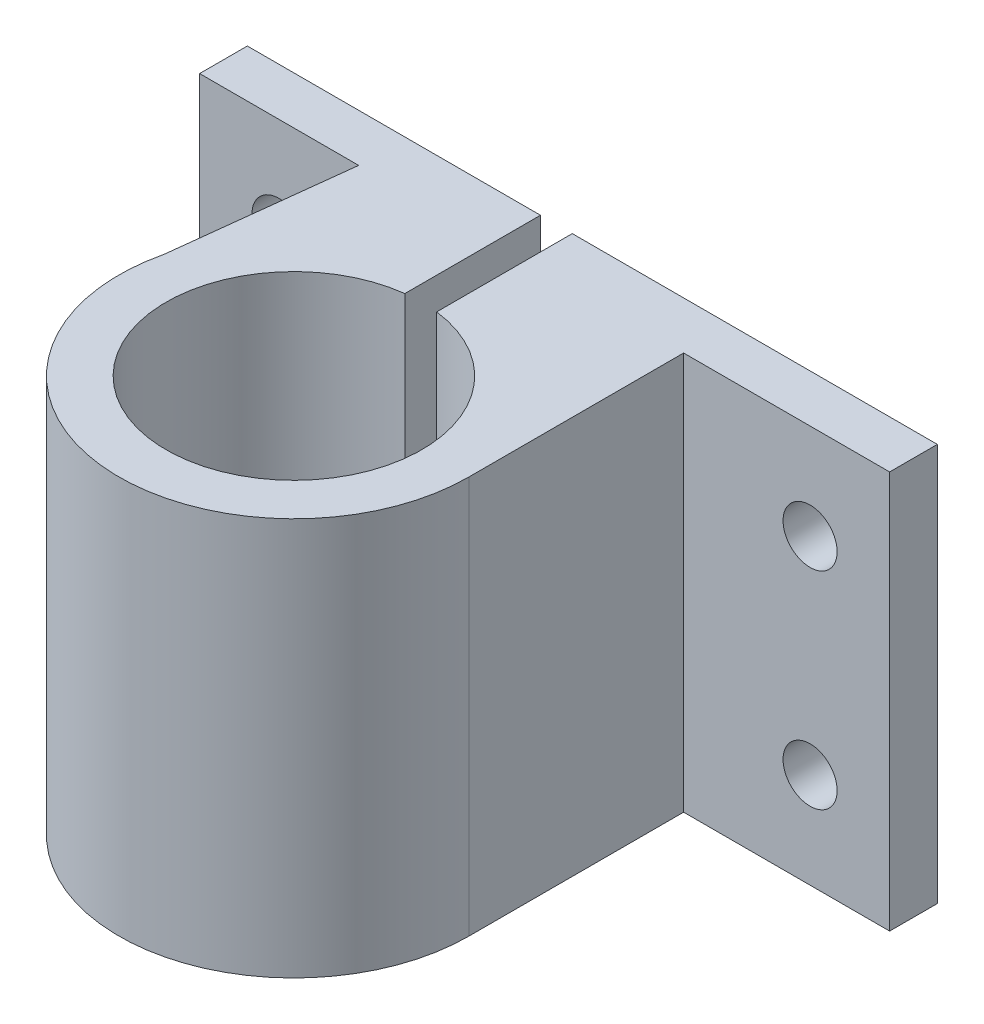
ISO-10303-21;
HEADER;
FILE_DESCRIPTION(('STEP AP214'),'2;1');
FILE_NAME('part.step','',(''),(''),'','','');
FILE_SCHEMA(('AUTOMOTIVE_DESIGN { 1 0 10303 214 1 1 1 1 }'));
ENDSEC;
DATA;
#1=APPLICATION_CONTEXT('core data for automotive mechanical design processes');
#2=APPLICATION_PROTOCOL_DEFINITION('international standard','automotive_design',2000,#1);
#3=PRODUCT_CONTEXT('',#1,'mechanical');
#4=PRODUCT('Part','Part','',(#3));
#5=PRODUCT_RELATED_PRODUCT_CATEGORY('part','',(#4));
#6=PRODUCT_DEFINITION_FORMATION('','',#4);
#7=PRODUCT_DEFINITION_CONTEXT('part definition',#1,'design');
#8=PRODUCT_DEFINITION('design','',#6,#7);
#9=PRODUCT_DEFINITION_SHAPE('','',#8);
#10=(LENGTH_UNIT() NAMED_UNIT(*) SI_UNIT(.MILLI.,.METRE.));
#11=(NAMED_UNIT(*) PLANE_ANGLE_UNIT() SI_UNIT($,.RADIAN.));
#12=(NAMED_UNIT(*) SI_UNIT($,.STERADIAN.) SOLID_ANGLE_UNIT());
#13=UNCERTAINTY_MEASURE_WITH_UNIT(LENGTH_MEASURE(1.E-05),#10,'distance_accuracy_value','');
#14=(GEOMETRIC_REPRESENTATION_CONTEXT(3) GLOBAL_UNCERTAINTY_ASSIGNED_CONTEXT((#13)) GLOBAL_UNIT_ASSIGNED_CONTEXT((#10,
#11,#12)) REPRESENTATION_CONTEXT('',''));
#15=CARTESIAN_POINT('',(0.,0.,0.));
#16=DIRECTION('',(0.,0.,1.));
#17=DIRECTION('',(1.,0.,0.));
#18=AXIS2_PLACEMENT_3D('',#15,#16,#17);
#19=CARTESIAN_POINT('',(201.264846255045,159.563588926656,23.4443950566083));
#20=DIRECTION('',(0.993283858825518,0.,0.115702963646957));
#21=DIRECTION('',(0.115702963646957,0.,-0.993283858825518));
#22=AXIS2_PLACEMENT_3D('',#19,#20,#21);
#23=PLANE('',#22);
#24=DIRECTION('',(0.,1.,0.));
#25=VECTOR('',#24,1.);
#26=CARTESIAN_POINT('',(203.646317651163,159.563588926656,2.99999999999998));
#27=LINE('',#26,#25);
#28=CARTESIAN_POINT('',(203.646317651163,210.923622409626,2.99999999999998));
#29=VERTEX_POINT('',#28);
#30=CARTESIAN_POINT('',(203.646317651163,235.923622409626,2.99999999999998));
#31=VERTEX_POINT('',#30);
#32=EDGE_CURVE('E176',#29,#31,#27,.T.);
#33=ORIENTED_EDGE('',*,*,#32,.F.);
#34=DIRECTION('',(-0.115702963646957,0.,0.993283858825518));
#35=VECTOR('',#34,1.);
#36=CARTESIAN_POINT('',(201.264846255045,210.923622409626,23.4443950566083));
#37=LINE('',#36,#35);
#38=CARTESIAN_POINT('',(202.368284031666,210.923622409626,13.9716305034047));
#39=VERTEX_POINT('',#38);
#40=EDGE_CURVE('E44',#29,#39,#37,.T.);
#41=ORIENTED_EDGE('',*,*,#40,.T.);
#42=DIRECTION('',(0.,1.,0.));
#43=VECTOR('',#42,1.);
#44=CARTESIAN_POINT('',(202.368284031666,159.563588926656,13.9716305034047));
#45=LINE('',#44,#43);
#46=CARTESIAN_POINT('',(202.368284031666,235.923622409626,13.9716305034047));
#47=VERTEX_POINT('',#46);
#48=EDGE_CURVE('E124',#39,#47,#45,.T.);
#49=ORIENTED_EDGE('',*,*,#48,.T.);
#50=DIRECTION('',(0.115702963646957,0.,-0.993283858825518));
#51=VECTOR('',#50,1.);
#52=CARTESIAN_POINT('',(201.264846255045,235.923622409626,23.4443950566083));
#53=LINE('',#52,#51);
#54=EDGE_CURVE('E127',#47,#31,#53,.T.);
#55=ORIENTED_EDGE('',*,*,#54,.T.);
#56=EDGE_LOOP('',(#33,#41,#49,#55));
#57=FACE_BOUND('',#56,.T.);
#58=ADVANCED_FACE('F36',(#57),#23,.F.);
#59=CARTESIAN_POINT('',(0.,159.563588926656,2.99999999999991));
#60=DIRECTION('',(0.,0.,1.));
#61=DIRECTION('',(1.,0.,0.));
#62=AXIS2_PLACEMENT_3D('',#59,#60,#61);
#63=PLANE('',#62);
#64=CARTESIAN_POINT('',(198.637476238575,216.923622409726,3.00000000000003));
#65=DIRECTION('',(0.,0.,1.));
#66=DIRECTION('',(1.,0.,0.));
#67=AXIS2_PLACEMENT_3D('',#64,#65,#66);
#68=CIRCLE('',#67,1.70000000000001);
#69=CARTESIAN_POINT('',(200.337476238575,216.923622409726,3.00000000000003));
#70=VERTEX_POINT('',#69);
#71=EDGE_CURVE('E313',#70,#70,#68,.T.);
#72=ORIENTED_EDGE('',*,*,#71,.F.);
#73=EDGE_LOOP('',(#72));
#74=FACE_BOUND('',#73,.T.);
#75=CARTESIAN_POINT('',(198.637476238575,229.923622409726,3.00000000000003));
#76=DIRECTION('',(0.,0.,1.));
#77=DIRECTION('',(1.,0.,0.));
#78=AXIS2_PLACEMENT_3D('',#75,#76,#77);
#79=CIRCLE('',#78,1.70000000000001);
#80=CARTESIAN_POINT('',(200.337476238575,229.923622409726,3.00000000000003));
#81=VERTEX_POINT('',#80);
#82=EDGE_CURVE('E209',#81,#81,#79,.T.);
#83=ORIENTED_EDGE('',*,*,#82,.F.);
#84=EDGE_LOOP('',(#83));
#85=FACE_BOUND('',#84,.T.);
#86=DIRECTION('',(-1.,0.,0.));
#87=VECTOR('',#86,1.);
#88=CARTESIAN_POINT('',(0.,210.923622409626,2.99999999999991));
#89=LINE('',#88,#87);
#90=CARTESIAN_POINT('',(193.646317651163,210.923622409626,2.99999999999998));
#91=VERTEX_POINT('',#90);
#92=EDGE_CURVE('E52',#29,#91,#89,.T.);
#93=ORIENTED_EDGE('',*,*,#92,.F.);
#94=ORIENTED_EDGE('',*,*,#32,.T.);
#95=DIRECTION('',(1.,0.,0.));
#96=VECTOR('',#95,1.);
#97=CARTESIAN_POINT('',(0.,235.923622409626,2.99999999999991));
#98=LINE('',#97,#96);
#99=CARTESIAN_POINT('',(193.646317651163,235.923622409626,2.99999999999998));
#100=VERTEX_POINT('',#99);
#101=EDGE_CURVE('E133',#100,#31,#98,.T.);
#102=ORIENTED_EDGE('',*,*,#101,.F.);
#103=DIRECTION('',(0.,1.,0.));
#104=VECTOR('',#103,1.);
#105=CARTESIAN_POINT('',(193.646317651163,159.563588926656,2.99999999999998));
#106=LINE('',#105,#104);
#107=EDGE_CURVE('E179',#91,#100,#106,.T.);
#108=ORIENTED_EDGE('',*,*,#107,.F.);
#109=EDGE_LOOP('',(#93,#94,#102,#108));
#110=FACE_BOUND('',#109,.T.);
#111=ADVANCED_FACE('F239',(#74,#85,#110),#63,.T.);
#112=CARTESIAN_POINT('',(193.646317651163,159.563588926656,0.));
#113=DIRECTION('',(1.,0.,0.));
#114=DIRECTION('',(0.,0.,-1.));
#115=AXIS2_PLACEMENT_3D('',#112,#113,#114);
#116=PLANE('',#115);
#117=DIRECTION('',(0.,1.,0.));
#118=VECTOR('',#117,1.);
#119=CARTESIAN_POINT('',(193.646317651163,159.563588926656,0.));
#120=LINE('',#119,#118);
#121=CARTESIAN_POINT('',(193.646317651163,210.923622409626,0.));
#122=VERTEX_POINT('',#121);
#123=CARTESIAN_POINT('',(193.646317651163,235.923622409626,0.));
#124=VERTEX_POINT('',#123);
#125=EDGE_CURVE('E181',#122,#124,#120,.T.);
#126=ORIENTED_EDGE('',*,*,#125,.F.);
#127=DIRECTION('',(0.,0.,1.));
#128=VECTOR('',#127,1.);
#129=CARTESIAN_POINT('',(193.646317651163,210.923622409626,0.));
#130=LINE('',#129,#128);
#131=EDGE_CURVE('E56',#122,#91,#130,.T.);
#132=ORIENTED_EDGE('',*,*,#131,.T.);
#133=ORIENTED_EDGE('',*,*,#107,.T.);
#134=DIRECTION('',(0.,0.,-1.));
#135=VECTOR('',#134,1.);
#136=CARTESIAN_POINT('',(193.646317651163,235.923622409626,0.));
#137=LINE('',#136,#135);
#138=EDGE_CURVE('E172',#100,#124,#137,.T.);
#139=ORIENTED_EDGE('',*,*,#138,.T.);
#140=EDGE_LOOP('',(#126,#132,#133,#139));
#141=FACE_BOUND('',#140,.T.);
#142=ADVANCED_FACE('F237',(#141),#116,.F.);
#143=CARTESIAN_POINT('',(0.,159.563588926656,0.));
#144=DIRECTION('',(0.,0.,1.));
#145=DIRECTION('',(1.,0.,0.));
#146=AXIS2_PLACEMENT_3D('',#143,#144,#145);
#147=PLANE('',#146);
#148=CARTESIAN_POINT('',(198.637476238575,216.923622409726,0.));
#149=DIRECTION('',(0.,0.,1.));
#150=DIRECTION('',(1.,0.,0.));
#151=AXIS2_PLACEMENT_3D('',#148,#149,#150);
#152=CIRCLE('',#151,1.70000000000001);
#153=CARTESIAN_POINT('',(200.337476238575,216.923622409726,0.));
#154=VERTEX_POINT('',#153);
#155=EDGE_CURVE('E39',#154,#154,#152,.T.);
#156=ORIENTED_EDGE('',*,*,#155,.T.);
#157=EDGE_LOOP('',(#156));
#158=FACE_BOUND('',#157,.T.);
#159=CARTESIAN_POINT('',(198.637476238575,229.923622409726,0.));
#160=DIRECTION('',(0.,0.,1.));
#161=DIRECTION('',(1.,0.,0.));
#162=AXIS2_PLACEMENT_3D('',#159,#160,#161);
#163=CIRCLE('',#162,1.70000000000001);
#164=CARTESIAN_POINT('',(200.337476238575,229.923622409726,0.));
#165=VERTEX_POINT('',#164);
#166=EDGE_CURVE('E197',#165,#165,#163,.T.);
#167=ORIENTED_EDGE('',*,*,#166,.T.);
#168=EDGE_LOOP('',(#167));
#169=FACE_BOUND('',#168,.T.);
#170=DIRECTION('',(0.,1.,0.));
#171=VECTOR('',#170,1.);
#172=CARTESIAN_POINT('',(212.07376616414,159.563588926656,0.));
#173=LINE('',#172,#171);
#174=CARTESIAN_POINT('',(212.07376616414,210.923622409626,0.));
#175=VERTEX_POINT('',#174);
#176=CARTESIAN_POINT('',(212.07376616414,235.923622409626,0.));
#177=VERTEX_POINT('',#176);
#178=EDGE_CURVE('E183',#175,#177,#173,.T.);
#179=ORIENTED_EDGE('',*,*,#178,.F.);
#180=DIRECTION('',(-1.,0.,0.));
#181=VECTOR('',#180,1.);
#182=CARTESIAN_POINT('',(0.,210.923622409626,0.));
#183=LINE('',#182,#181);
#184=EDGE_CURVE('E231',#175,#122,#183,.T.);
#185=ORIENTED_EDGE('',*,*,#184,.T.);
#186=ORIENTED_EDGE('',*,*,#125,.T.);
#187=DIRECTION('',(1.,0.,0.));
#188=VECTOR('',#187,1.);
#189=CARTESIAN_POINT('',(0.,235.923622409626,0.));
#190=LINE('',#189,#188);
#191=EDGE_CURVE('E169',#124,#177,#190,.T.);
#192=ORIENTED_EDGE('',*,*,#191,.T.);
#193=EDGE_LOOP('',(#179,#185,#186,#192));
#194=FACE_BOUND('',#193,.T.);
#195=ADVANCED_FACE('F247',(#158,#169,#194),#147,.F.);
#196=CARTESIAN_POINT('',(212.07376616414,159.563588926656,0.));
#197=DIRECTION('',(1.,0.,0.));
#198=DIRECTION('',(0.,0.,-1.));
#199=AXIS2_PLACEMENT_3D('',#196,#197,#198);
#200=PLANE('',#199);
#201=DIRECTION('',(0.,0.,1.));
#202=VECTOR('',#201,1.);
#203=CARTESIAN_POINT('',(212.07376616414,210.923622409626,0.));
#204=LINE('',#203,#202);
#205=CARTESIAN_POINT('',(212.07376616414,210.923622409626,8.52418062321119));
#206=VERTEX_POINT('',#205);
#207=EDGE_CURVE('E229',#175,#206,#204,.T.);
#208=ORIENTED_EDGE('',*,*,#207,.F.);
#209=ORIENTED_EDGE('',*,*,#178,.T.);
#210=DIRECTION('',(0.,0.,-1.));
#211=VECTOR('',#210,1.);
#212=CARTESIAN_POINT('',(212.07376616414,235.923622409626,0.));
#213=LINE('',#212,#211);
#214=CARTESIAN_POINT('',(212.07376616414,235.923622409626,8.52418062321119));
#215=VERTEX_POINT('',#214);
#216=EDGE_CURVE('E166',#215,#177,#213,.T.);
#217=ORIENTED_EDGE('',*,*,#216,.F.);
#218=DIRECTION('',(0.,1.,0.));
#219=VECTOR('',#218,1.);
#220=CARTESIAN_POINT('',(212.07376616414,159.563588926656,8.52418062321119));
#221=LINE('',#220,#219);
#222=EDGE_CURVE('E185',#206,#215,#221,.T.);
#223=ORIENTED_EDGE('',*,*,#222,.F.);
#224=EDGE_LOOP('',(#208,#209,#217,#223));
#225=FACE_BOUND('',#224,.T.);
#226=ADVANCED_FACE('F256',(#225),#200,.T.);
#227=CARTESIAN_POINT('',(213.07376616414,159.563588926656,16.4999999999985));
#228=DIRECTION('',(0.,1.,0.));
#229=DIRECTION('',(0.,0.,1.));
#230=AXIS2_PLACEMENT_3D('',#227,#228,#229);
#231=CYLINDRICAL_SURFACE('',#230,8.03826441037711);
#232=DIRECTION('',(0.,1.,0.));
#233=VECTOR('',#232,1.);
#234=CARTESIAN_POINT('',(214.07376616414,159.563588926656,8.52418062321119));
#235=LINE('',#234,#233);
#236=CARTESIAN_POINT('',(214.07376616414,210.923622409626,8.52418062321119));
#237=VERTEX_POINT('',#236);
#238=CARTESIAN_POINT('',(214.07376616414,235.923622409626,8.52418062321119));
#239=VERTEX_POINT('',#238);
#240=EDGE_CURVE('E187',#237,#239,#235,.T.);
#241=ORIENTED_EDGE('',*,*,#240,.F.);
#242=CARTESIAN_POINT('',(213.07376616414,210.923622409626,16.4999999999985));
#243=DIRECTION('',(0.,1.,0.));
#244=DIRECTION('',(0.,0.,1.));
#245=AXIS2_PLACEMENT_3D('',#242,#243,#244);
#246=CIRCLE('',#245,8.03826441037711);
#247=EDGE_CURVE('E226',#237,#206,#246,.F.);
#248=ORIENTED_EDGE('',*,*,#247,.T.);
#249=ORIENTED_EDGE('',*,*,#222,.T.);
#250=CARTESIAN_POINT('',(213.07376616414,235.923622409626,16.4999999999985));
#251=DIRECTION('',(0.,1.,0.));
#252=DIRECTION('',(0.,0.,1.));
#253=AXIS2_PLACEMENT_3D('',#250,#251,#252);
#254=CIRCLE('',#253,8.03826441037711);
#255=EDGE_CURVE('E163',#215,#239,#254,.T.);
#256=ORIENTED_EDGE('',*,*,#255,.T.);
#257=EDGE_LOOP('',(#241,#248,#249,#256));
#258=FACE_BOUND('',#257,.T.);
#259=ADVANCED_FACE('F260',(#258),#231,.F.);
#260=CARTESIAN_POINT('',(214.07376616414,159.563588926656,0.));
#261=DIRECTION('',(1.,0.,0.));
#262=DIRECTION('',(0.,0.,-1.));
#263=AXIS2_PLACEMENT_3D('',#260,#261,#262);
#264=PLANE('',#263);
#265=DIRECTION('',(0.,1.,0.));
#266=VECTOR('',#265,1.);
#267=CARTESIAN_POINT('',(214.07376616414,159.563588926656,0.));
#268=LINE('',#267,#266);
#269=CARTESIAN_POINT('',(214.07376616414,210.923622409626,0.));
#270=VERTEX_POINT('',#269);
#271=CARTESIAN_POINT('',(214.07376616414,235.923622409626,0.));
#272=VERTEX_POINT('',#271);
#273=EDGE_CURVE('E189',#270,#272,#268,.T.);
#274=ORIENTED_EDGE('',*,*,#273,.F.);
#275=DIRECTION('',(0.,0.,1.));
#276=VECTOR('',#275,1.);
#277=CARTESIAN_POINT('',(214.07376616414,210.923622409626,0.));
#278=LINE('',#277,#276);
#279=EDGE_CURVE('E223',#270,#237,#278,.T.);
#280=ORIENTED_EDGE('',*,*,#279,.T.);
#281=ORIENTED_EDGE('',*,*,#240,.T.);
#282=DIRECTION('',(0.,0.,-1.));
#283=VECTOR('',#282,1.);
#284=CARTESIAN_POINT('',(214.07376616414,235.923622409626,0.));
#285=LINE('',#284,#283);
#286=EDGE_CURVE('E160',#239,#272,#285,.T.);
#287=ORIENTED_EDGE('',*,*,#286,.T.);
#288=EDGE_LOOP('',(#274,#280,#281,#287));
#289=FACE_BOUND('',#288,.T.);
#290=ADVANCED_FACE('F264',(#289),#264,.F.);
#291=CARTESIAN_POINT('',(0.,159.563588926656,0.));
#292=DIRECTION('',(0.,0.,1.));
#293=DIRECTION('',(1.,0.,0.));
#294=AXIS2_PLACEMENT_3D('',#291,#292,#293);
#295=PLANE('',#294);
#296=CARTESIAN_POINT('',(232.023766162686,229.923622409726,0.));
#297=DIRECTION('',(0.,0.,1.));
#298=DIRECTION('',(1.,0.,0.));
#299=AXIS2_PLACEMENT_3D('',#296,#297,#298);
#300=CIRCLE('',#299,1.69999999999999);
#301=CARTESIAN_POINT('',(233.723766162686,229.923622409726,0.));
#302=VERTEX_POINT('',#301);
#303=EDGE_CURVE('E199',#302,#302,#300,.T.);
#304=ORIENTED_EDGE('',*,*,#303,.T.);
#305=EDGE_LOOP('',(#304));
#306=FACE_BOUND('',#305,.T.);
#307=CARTESIAN_POINT('',(232.023766162686,216.923622409726,0.));
#308=DIRECTION('',(0.,0.,1.));
#309=DIRECTION('',(1.,0.,0.));
#310=AXIS2_PLACEMENT_3D('',#307,#308,#309);
#311=CIRCLE('',#310,1.69999999999999);
#312=CARTESIAN_POINT('',(233.723766162686,216.923622409726,0.));
#313=VERTEX_POINT('',#312);
#314=EDGE_CURVE('E204',#313,#313,#311,.T.);
#315=ORIENTED_EDGE('',*,*,#314,.T.);
#316=EDGE_LOOP('',(#315));
#317=FACE_BOUND('',#316,.T.);
#318=DIRECTION('',(0.,1.,0.));
#319=VECTOR('',#318,1.);
#320=CARTESIAN_POINT('',(237.023766162708,159.563588926656,0.));
#321=LINE('',#320,#319);
#322=CARTESIAN_POINT('',(237.023766162708,210.923622409626,0.));
#323=VERTEX_POINT('',#322);
#324=CARTESIAN_POINT('',(237.023766162708,235.923622409626,0.));
#325=VERTEX_POINT('',#324);
#326=EDGE_CURVE('E191',#323,#325,#321,.T.);
#327=ORIENTED_EDGE('',*,*,#326,.F.);
#328=DIRECTION('',(-1.,0.,0.));
#329=VECTOR('',#328,1.);
#330=CARTESIAN_POINT('',(0.,210.923622409626,0.));
#331=LINE('',#330,#329);
#332=EDGE_CURVE('E220',#323,#270,#331,.T.);
#333=ORIENTED_EDGE('',*,*,#332,.T.);
#334=ORIENTED_EDGE('',*,*,#273,.T.);
#335=DIRECTION('',(1.,0.,0.));
#336=VECTOR('',#335,1.);
#337=CARTESIAN_POINT('',(0.,235.923622409626,0.));
#338=LINE('',#337,#336);
#339=EDGE_CURVE('E157',#272,#325,#338,.T.);
#340=ORIENTED_EDGE('',*,*,#339,.T.);
#341=EDGE_LOOP('',(#327,#333,#334,#340));
#342=FACE_BOUND('',#341,.T.);
#343=ADVANCED_FACE('F268',(#306,#317,#342),#295,.F.);
#344=CARTESIAN_POINT('',(237.023766162708,159.563588926656,0.));
#345=DIRECTION('',(-1.,0.,0.));
#346=DIRECTION('',(0.,0.,1.));
#347=AXIS2_PLACEMENT_3D('',#344,#345,#346);
#348=PLANE('',#347);
#349=DIRECTION('',(0.,1.,0.));
#350=VECTOR('',#349,1.);
#351=CARTESIAN_POINT('',(237.023766162708,159.563588926656,2.99999999999998));
#352=LINE('',#351,#350);
#353=CARTESIAN_POINT('',(237.023766162708,210.923622409626,2.99999999999998));
#354=VERTEX_POINT('',#353);
#355=CARTESIAN_POINT('',(237.023766162708,235.923622409626,2.99999999999998));
#356=VERTEX_POINT('',#355);
#357=EDGE_CURVE('E193',#354,#356,#352,.T.);
#358=ORIENTED_EDGE('',*,*,#357,.F.);
#359=DIRECTION('',(0.,0.,-1.));
#360=VECTOR('',#359,1.);
#361=CARTESIAN_POINT('',(237.023766162708,210.923622409626,0.));
#362=LINE('',#361,#360);
#363=EDGE_CURVE('E217',#354,#323,#362,.T.);
#364=ORIENTED_EDGE('',*,*,#363,.T.);
#365=ORIENTED_EDGE('',*,*,#326,.T.);
#366=DIRECTION('',(0.,0.,1.));
#367=VECTOR('',#366,1.);
#368=CARTESIAN_POINT('',(237.023766162708,235.923622409626,0.));
#369=LINE('',#368,#367);
#370=EDGE_CURVE('E154',#325,#356,#369,.T.);
#371=ORIENTED_EDGE('',*,*,#370,.T.);
#372=EDGE_LOOP('',(#358,#364,#365,#371));
#373=FACE_BOUND('',#372,.T.);
#374=ADVANCED_FACE('F272',(#373),#348,.F.);
#375=CARTESIAN_POINT('',(0.,159.563588926656,3.00000000000003));
#376=DIRECTION('',(0.,0.,-1.));
#377=DIRECTION('',(-1.,0.,0.));
#378=AXIS2_PLACEMENT_3D('',#375,#376,#377);
#379=PLANE('',#378);
#380=CARTESIAN_POINT('',(232.023766162686,229.923622409726,3.00000000000003));
#381=DIRECTION('',(0.,0.,1.));
#382=DIRECTION('',(1.,0.,0.));
#383=AXIS2_PLACEMENT_3D('',#380,#381,#382);
#384=CIRCLE('',#383,1.69999999999999);
#385=CARTESIAN_POINT('',(233.723766162686,229.923622409726,3.00000000000003));
#386=VERTEX_POINT('',#385);
#387=EDGE_CURVE('E334',#386,#386,#384,.T.);
#388=ORIENTED_EDGE('',*,*,#387,.F.);
#389=EDGE_LOOP('',(#388));
#390=FACE_BOUND('',#389,.T.);
#391=CARTESIAN_POINT('',(232.023766162686,216.923622409726,3.00000000000003));
#392=DIRECTION('',(0.,0.,1.));
#393=DIRECTION('',(1.,0.,0.));
#394=AXIS2_PLACEMENT_3D('',#391,#392,#393);
#395=CIRCLE('',#394,1.69999999999999);
#396=CARTESIAN_POINT('',(233.723766162686,216.923622409726,3.00000000000003));
#397=VERTEX_POINT('',#396);
#398=EDGE_CURVE('E338',#397,#397,#395,.T.);
#399=ORIENTED_EDGE('',*,*,#398,.F.);
#400=EDGE_LOOP('',(#399));
#401=FACE_BOUND('',#400,.T.);
#402=DIRECTION('',(0.,1.,0.));
#403=VECTOR('',#402,1.);
#404=CARTESIAN_POINT('',(224.073766164141,159.563588926656,2.99999999999998));
#405=LINE('',#404,#403);
#406=CARTESIAN_POINT('',(224.073766164141,210.923622409626,2.99999999999998));
#407=VERTEX_POINT('',#406);
#408=CARTESIAN_POINT('',(224.073766164141,235.923622409626,2.99999999999998));
#409=VERTEX_POINT('',#408);
#410=EDGE_CURVE('E195',#407,#409,#405,.T.);
#411=ORIENTED_EDGE('',*,*,#410,.F.);
#412=DIRECTION('',(1.,0.,0.));
#413=VECTOR('',#412,1.);
#414=CARTESIAN_POINT('',(0.,210.923622409626,3.00000000000003));
#415=LINE('',#414,#413);
#416=EDGE_CURVE('E214',#407,#354,#415,.T.);
#417=ORIENTED_EDGE('',*,*,#416,.T.);
#418=ORIENTED_EDGE('',*,*,#357,.T.);
#419=DIRECTION('',(-1.,0.,0.));
#420=VECTOR('',#419,1.);
#421=CARTESIAN_POINT('',(0.,235.923622409626,3.00000000000003));
#422=LINE('',#421,#420);
#423=EDGE_CURVE('E148',#356,#409,#422,.T.);
#424=ORIENTED_EDGE('',*,*,#423,.T.);
#425=EDGE_LOOP('',(#411,#417,#418,#424));
#426=FACE_BOUND('',#425,.T.);
#427=ADVANCED_FACE('F275',(#390,#401,#426),#379,.F.);
#428=CARTESIAN_POINT('',(224.073766164141,159.563588926656,0.));
#429=DIRECTION('',(1.,0.,0.));
#430=DIRECTION('',(0.,0.,-1.));
#431=AXIS2_PLACEMENT_3D('',#428,#429,#430);
#432=PLANE('',#431);
#433=DIRECTION('',(0.,0.,1.));
#434=VECTOR('',#433,1.);
#435=CARTESIAN_POINT('',(224.073766164141,210.923622409626,0.));
#436=LINE('',#435,#434);
#437=CARTESIAN_POINT('',(224.073766164141,210.923622409626,16.4999999999985));
#438=VERTEX_POINT('',#437);
#439=EDGE_CURVE('E178',#407,#438,#436,.T.);
#440=ORIENTED_EDGE('',*,*,#439,.F.);
#441=ORIENTED_EDGE('',*,*,#410,.T.);
#442=DIRECTION('',(0.,0.,-1.));
#443=VECTOR('',#442,1.);
#444=CARTESIAN_POINT('',(224.073766164141,235.923622409626,0.));
#445=LINE('',#444,#443);
#446=CARTESIAN_POINT('',(224.073766164141,235.923622409626,16.4999999999985));
#447=VERTEX_POINT('',#446);
#448=EDGE_CURVE('E146',#447,#409,#445,.T.);
#449=ORIENTED_EDGE('',*,*,#448,.F.);
#450=DIRECTION('',(0.,1.,0.));
#451=VECTOR('',#450,1.);
#452=CARTESIAN_POINT('',(224.073766164141,159.563588926656,16.4999999999985));
#453=LINE('',#452,#451);
#454=EDGE_CURVE('E132',#438,#447,#453,.T.);
#455=ORIENTED_EDGE('',*,*,#454,.F.);
#456=EDGE_LOOP('',(#440,#441,#449,#455));
#457=FACE_BOUND('',#456,.T.);
#458=ADVANCED_FACE('F279',(#457),#432,.T.);
#459=CARTESIAN_POINT('',(213.07376616414,159.563588926656,16.4999999999985));
#460=DIRECTION('',(0.,1.,0.));
#461=DIRECTION('',(0.,0.,1.));
#462=AXIS2_PLACEMENT_3D('',#459,#460,#461);
#463=CYLINDRICAL_SURFACE('',#462,11.0000000000015);
#464=CARTESIAN_POINT('',(213.07376616414,210.923622409626,16.4999999999985));
#465=DIRECTION('',(0.,1.,0.));
#466=DIRECTION('',(0.,0.,1.));
#467=AXIS2_PLACEMENT_3D('',#464,#465,#466);
#468=CIRCLE('',#467,11.0000000000015);
#469=EDGE_CURVE('E11',#438,#39,#468,.F.);
#470=ORIENTED_EDGE('',*,*,#469,.F.);
#471=ORIENTED_EDGE('',*,*,#454,.T.);
#472=CARTESIAN_POINT('',(213.07376616414,235.923622409626,16.4999999999985));
#473=DIRECTION('',(0.,1.,0.));
#474=DIRECTION('',(0.,0.,1.));
#475=AXIS2_PLACEMENT_3D('',#472,#473,#474);
#476=CIRCLE('',#475,11.0000000000015);
#477=EDGE_CURVE('E139',#47,#447,#476,.T.);
#478=ORIENTED_EDGE('',*,*,#477,.F.);
#479=ORIENTED_EDGE('',*,*,#48,.F.);
#480=EDGE_LOOP('',(#470,#471,#478,#479));
#481=FACE_BOUND('',#480,.T.);
#482=ADVANCED_FACE('F143',(#481),#463,.T.);
#483=CARTESIAN_POINT('',(0.,235.923622409626,0.));
#484=DIRECTION('',(0.,1.,0.));
#485=DIRECTION('',(0.,0.,1.));
#486=AXIS2_PLACEMENT_3D('',#483,#484,#485);
#487=PLANE('',#486);
#488=ORIENTED_EDGE('',*,*,#54,.F.);
#489=ORIENTED_EDGE('',*,*,#477,.T.);
#490=ORIENTED_EDGE('',*,*,#448,.T.);
#491=ORIENTED_EDGE('',*,*,#423,.F.);
#492=ORIENTED_EDGE('',*,*,#370,.F.);
#493=ORIENTED_EDGE('',*,*,#339,.F.);
#494=ORIENTED_EDGE('',*,*,#286,.F.);
#495=ORIENTED_EDGE('',*,*,#255,.F.);
#496=ORIENTED_EDGE('',*,*,#216,.T.);
#497=ORIENTED_EDGE('',*,*,#191,.F.);
#498=ORIENTED_EDGE('',*,*,#138,.F.);
#499=ORIENTED_EDGE('',*,*,#101,.T.);
#500=EDGE_LOOP('',(#488,#489,#490,#491,#492,#493,#494,#495,#496,#497,#498,#499));
#501=FACE_BOUND('',#500,.T.);
#502=ADVANCED_FACE('F137',(#501),#487,.T.);
#503=CARTESIAN_POINT('',(0.,210.923622409626,0.));
#504=DIRECTION('',(0.,1.,0.));
#505=DIRECTION('',(0.,0.,1.));
#506=AXIS2_PLACEMENT_3D('',#503,#504,#505);
#507=PLANE('',#506);
#508=ORIENTED_EDGE('',*,*,#92,.T.);
#509=ORIENTED_EDGE('',*,*,#131,.F.);
#510=ORIENTED_EDGE('',*,*,#184,.F.);
#511=ORIENTED_EDGE('',*,*,#207,.T.);
#512=ORIENTED_EDGE('',*,*,#247,.F.);
#513=ORIENTED_EDGE('',*,*,#279,.F.);
#514=ORIENTED_EDGE('',*,*,#332,.F.);
#515=ORIENTED_EDGE('',*,*,#363,.F.);
#516=ORIENTED_EDGE('',*,*,#416,.F.);
#517=ORIENTED_EDGE('',*,*,#439,.T.);
#518=ORIENTED_EDGE('',*,*,#469,.T.);
#519=ORIENTED_EDGE('',*,*,#40,.F.);
#520=EDGE_LOOP('',(#508,#509,#510,#511,#512,#513,#514,#515,#516,#517,#518,#519));
#521=FACE_BOUND('',#520,.T.);
#522=ADVANCED_FACE('F287',(#521),#507,.F.);
#523=CARTESIAN_POINT('',(232.023766162686,216.923622409726,-6.99999999999998));
#524=DIRECTION('',(0.,0.,1.));
#525=DIRECTION('',(1.,0.,0.));
#526=AXIS2_PLACEMENT_3D('',#523,#524,#525);
#527=CYLINDRICAL_SURFACE('',#526,1.69999999999999);
#528=ORIENTED_EDGE('',*,*,#398,.T.);
#529=EDGE_LOOP('',(#528));
#530=FACE_BOUND('',#529,.T.);
#531=ORIENTED_EDGE('',*,*,#314,.F.);
#532=EDGE_LOOP('',(#531));
#533=FACE_BOUND('',#532,.T.);
#534=ADVANCED_FACE('F291',(#530,#533),#527,.F.);
#535=CARTESIAN_POINT('',(232.023766162686,229.923622409726,-6.99999999999998));
#536=DIRECTION('',(0.,0.,1.));
#537=DIRECTION('',(1.,0.,0.));
#538=AXIS2_PLACEMENT_3D('',#535,#536,#537);
#539=CYLINDRICAL_SURFACE('',#538,1.69999999999999);
#540=ORIENTED_EDGE('',*,*,#387,.T.);
#541=EDGE_LOOP('',(#540));
#542=FACE_BOUND('',#541,.T.);
#543=ORIENTED_EDGE('',*,*,#303,.F.);
#544=EDGE_LOOP('',(#543));
#545=FACE_BOUND('',#544,.T.);
#546=ADVANCED_FACE('F295',(#542,#545),#539,.F.);
#547=CARTESIAN_POINT('',(198.637476238575,229.923622409726,-6.99999999999998));
#548=DIRECTION('',(0.,0.,1.));
#549=DIRECTION('',(1.,0.,0.));
#550=AXIS2_PLACEMENT_3D('',#547,#548,#549);
#551=CYLINDRICAL_SURFACE('',#550,1.70000000000001);
#552=ORIENTED_EDGE('',*,*,#82,.T.);
#553=EDGE_LOOP('',(#552));
#554=FACE_BOUND('',#553,.T.);
#555=ORIENTED_EDGE('',*,*,#166,.F.);
#556=EDGE_LOOP('',(#555));
#557=FACE_BOUND('',#556,.T.);
#558=ADVANCED_FACE('F299',(#554,#557),#551,.F.);
#559=CARTESIAN_POINT('',(198.637476238575,216.923622409726,-6.99999999999998));
#560=DIRECTION('',(0.,0.,1.));
#561=DIRECTION('',(1.,0.,0.));
#562=AXIS2_PLACEMENT_3D('',#559,#560,#561);
#563=CYLINDRICAL_SURFACE('',#562,1.70000000000001);
#564=ORIENTED_EDGE('',*,*,#71,.T.);
#565=EDGE_LOOP('',(#564));
#566=FACE_BOUND('',#565,.T.);
#567=ORIENTED_EDGE('',*,*,#155,.F.);
#568=EDGE_LOOP('',(#567));
#569=FACE_BOUND('',#568,.T.);
#570=ADVANCED_FACE('F302',(#566,#569),#563,.F.);
#571=CLOSED_SHELL('',(#58,#111,#142,#195,#226,#259,#290,#343,#374,#427,#458,#482,#502,#522,#534,
#546,#558,#570));
#572=MANIFOLD_SOLID_BREP('B2',#571);
#573=ADVANCED_BREP_SHAPE_REPRESENTATION('',(#18,#572),#14);
#574=SHAPE_DEFINITION_REPRESENTATION(#9,#573);
ENDSEC;
END-ISO-10303-21;
